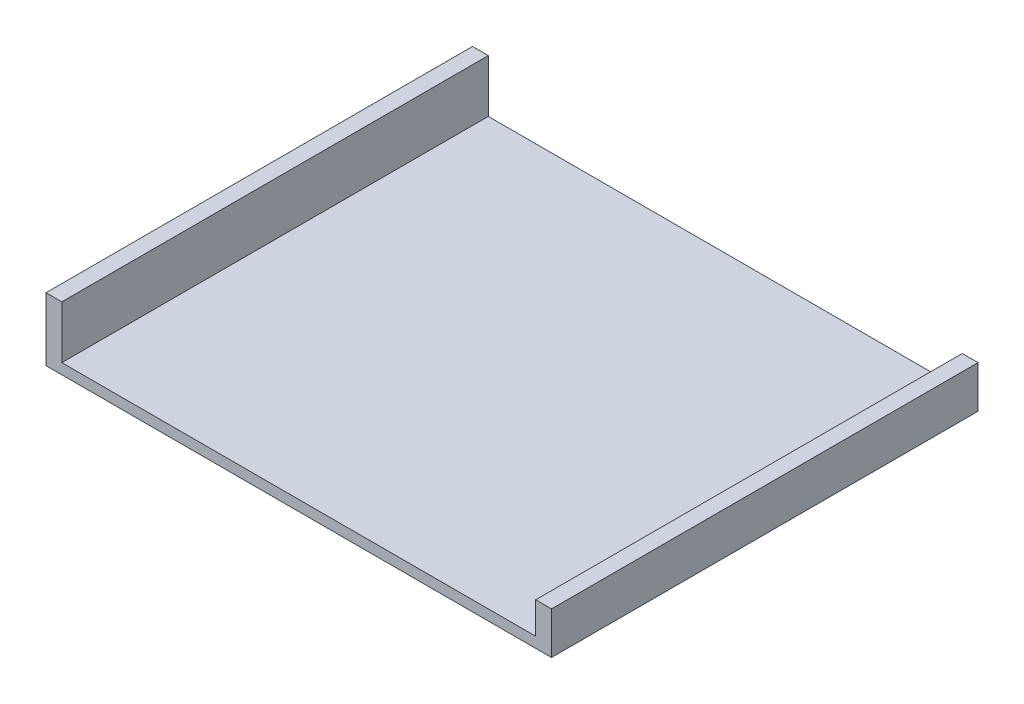
ISO-10303-21;
HEADER;
FILE_DESCRIPTION(('STEP AP214'),'2;1');
FILE_NAME('part.step','',(''),(''),'','','');
FILE_SCHEMA(('AUTOMOTIVE_DESIGN { 1 0 10303 214 1 1 1 1 }'));
ENDSEC;
DATA;
#1=APPLICATION_CONTEXT('core data for automotive mechanical design processes');
#2=APPLICATION_PROTOCOL_DEFINITION('international standard','automotive_design',2000,#1);
#3=PRODUCT_CONTEXT('',#1,'mechanical');
#4=PRODUCT('Part','Part','',(#3));
#5=PRODUCT_RELATED_PRODUCT_CATEGORY('part','',(#4));
#6=PRODUCT_DEFINITION_FORMATION('','',#4);
#7=PRODUCT_DEFINITION_CONTEXT('part definition',#1,'design');
#8=PRODUCT_DEFINITION('design','',#6,#7);
#9=PRODUCT_DEFINITION_SHAPE('','',#8);
#10=(LENGTH_UNIT() NAMED_UNIT(*) SI_UNIT(.MILLI.,.METRE.));
#11=(NAMED_UNIT(*) PLANE_ANGLE_UNIT() SI_UNIT($,.RADIAN.));
#12=(NAMED_UNIT(*) SI_UNIT($,.STERADIAN.) SOLID_ANGLE_UNIT());
#13=UNCERTAINTY_MEASURE_WITH_UNIT(LENGTH_MEASURE(1.E-05),#10,'distance_accuracy_value','');
#14=(GEOMETRIC_REPRESENTATION_CONTEXT(3) GLOBAL_UNCERTAINTY_ASSIGNED_CONTEXT((#13)) GLOBAL_UNIT_ASSIGNED_CONTEXT((#10,
#11,#12)) REPRESENTATION_CONTEXT('',''));
#15=CARTESIAN_POINT('',(0.,0.,0.));
#16=DIRECTION('',(0.,0.,1.));
#17=DIRECTION('',(1.,0.,0.));
#18=AXIS2_PLACEMENT_3D('',#15,#16,#17);
#19=CARTESIAN_POINT('',(-48.,2.,-40.5));
#20=DIRECTION('',(1.,0.,0.));
#21=DIRECTION('',(0.,0.,-1.));
#22=AXIS2_PLACEMENT_3D('',#19,#20,#21);
#23=PLANE('',#22);
#24=DIRECTION('',(0.,0.,1.));
#25=VECTOR('',#24,1.);
#26=CARTESIAN_POINT('',(-48.,0.,-40.5));
#27=LINE('',#26,#25);
#28=CARTESIAN_POINT('',(-48.,0.,-40.5));
#29=VERTEX_POINT('',#28);
#30=CARTESIAN_POINT('',(-48.,0.,40.5));
#31=VERTEX_POINT('',#30);
#32=EDGE_CURVE('E149',#29,#31,#27,.T.);
#33=ORIENTED_EDGE('',*,*,#32,.T.);
#34=DIRECTION('',(0.,-1.,0.));
#35=VECTOR('',#34,1.);
#36=CARTESIAN_POINT('',(-48.,2.,40.5));
#37=LINE('',#36,#35);
#38=CARTESIAN_POINT('',(-48.,12.,40.5));
#39=VERTEX_POINT('',#38);
#40=EDGE_CURVE('E11',#39,#31,#37,.T.);
#41=ORIENTED_EDGE('',*,*,#40,.F.);
#42=DIRECTION('',(0.,0.,1.));
#43=VECTOR('',#42,1.);
#44=CARTESIAN_POINT('',(-48.,12.,-40.5));
#45=LINE('',#44,#43);
#46=CARTESIAN_POINT('',(-48.,12.,-40.5));
#47=VERTEX_POINT('',#46);
#48=EDGE_CURVE('E129',#47,#39,#45,.T.);
#49=ORIENTED_EDGE('',*,*,#48,.F.);
#50=DIRECTION('',(0.,-1.,0.));
#51=VECTOR('',#50,1.);
#52=CARTESIAN_POINT('',(-48.,2.,-40.5));
#53=LINE('',#52,#51);
#54=EDGE_CURVE('E154',#47,#29,#53,.T.);
#55=ORIENTED_EDGE('',*,*,#54,.T.);
#56=EDGE_LOOP('',(#33,#41,#49,#55));
#57=FACE_BOUND('',#56,.T.);
#58=ADVANCED_FACE('F43',(#57),#23,.F.);
#59=CARTESIAN_POINT('',(-48.,2.,40.5));
#60=DIRECTION('',(0.,0.,-1.));
#61=DIRECTION('',(-1.,0.,0.));
#62=AXIS2_PLACEMENT_3D('',#59,#60,#61);
#63=PLANE('',#62);
#64=DIRECTION('',(1.,0.,0.));
#65=VECTOR('',#64,1.);
#66=CARTESIAN_POINT('',(-48.,0.,40.5));
#67=LINE('',#66,#65);
#68=CARTESIAN_POINT('',(48.,0.,40.5));
#69=VERTEX_POINT('',#68);
#70=EDGE_CURVE('E158',#31,#69,#67,.T.);
#71=ORIENTED_EDGE('',*,*,#70,.T.);
#72=DIRECTION('',(0.,-1.,0.));
#73=VECTOR('',#72,1.);
#74=CARTESIAN_POINT('',(48.,2.,40.5));
#75=LINE('',#74,#73);
#76=CARTESIAN_POINT('',(48.,8.,40.5));
#77=VERTEX_POINT('',#76);
#78=EDGE_CURVE('E49',#77,#69,#75,.T.);
#79=ORIENTED_EDGE('',*,*,#78,.F.);
#80=DIRECTION('',(1.,0.,0.));
#81=VECTOR('',#80,1.);
#82=CARTESIAN_POINT('',(45.,8.,40.5));
#83=LINE('',#82,#81);
#84=CARTESIAN_POINT('',(45.,8.,40.5));
#85=VERTEX_POINT('',#84);
#86=EDGE_CURVE('E106',#85,#77,#83,.T.);
#87=ORIENTED_EDGE('',*,*,#86,.F.);
#88=DIRECTION('',(0.,-1.,0.));
#89=VECTOR('',#88,1.);
#90=CARTESIAN_POINT('',(45.,8.,40.5));
#91=LINE('',#90,#89);
#92=CARTESIAN_POINT('',(45.,2.,40.5));
#93=VERTEX_POINT('',#92);
#94=EDGE_CURVE('E109',#85,#93,#91,.T.);
#95=ORIENTED_EDGE('',*,*,#94,.T.);
#96=DIRECTION('',(1.,0.,0.));
#97=VECTOR('',#96,1.);
#98=CARTESIAN_POINT('',(-48.,2.,40.5));
#99=LINE('',#98,#97);
#100=CARTESIAN_POINT('',(-45.,2.,40.5));
#101=VERTEX_POINT('',#100);
#102=EDGE_CURVE('E147',#101,#93,#99,.T.);
#103=ORIENTED_EDGE('',*,*,#102,.F.);
#104=DIRECTION('',(0.,-1.,0.));
#105=VECTOR('',#104,1.);
#106=CARTESIAN_POINT('',(-45.,12.,40.5));
#107=LINE('',#106,#105);
#108=CARTESIAN_POINT('',(-45.,12.,40.5));
#109=VERTEX_POINT('',#108);
#110=EDGE_CURVE('E148',#109,#101,#107,.T.);
#111=ORIENTED_EDGE('',*,*,#110,.F.);
#112=DIRECTION('',(1.,0.,0.));
#113=VECTOR('',#112,1.);
#114=CARTESIAN_POINT('',(-48.,12.,40.5));
#115=LINE('',#114,#113);
#116=EDGE_CURVE('E137',#39,#109,#115,.T.);
#117=ORIENTED_EDGE('',*,*,#116,.F.);
#118=ORIENTED_EDGE('',*,*,#40,.T.);
#119=EDGE_LOOP('',(#71,#79,#87,#95,#103,#111,#117,#118));
#120=FACE_BOUND('',#119,.T.);
#121=ADVANCED_FACE('F107',(#120),#63,.F.);
#122=CARTESIAN_POINT('',(48.,2.,40.5));
#123=DIRECTION('',(-1.,0.,0.));
#124=DIRECTION('',(0.,0.,1.));
#125=AXIS2_PLACEMENT_3D('',#122,#123,#124);
#126=PLANE('',#125);
#127=DIRECTION('',(0.,0.,-1.));
#128=VECTOR('',#127,1.);
#129=CARTESIAN_POINT('',(48.,0.,40.5));
#130=LINE('',#129,#128);
#131=CARTESIAN_POINT('',(48.,0.,-40.5));
#132=VERTEX_POINT('',#131);
#133=EDGE_CURVE('E159',#69,#132,#130,.T.);
#134=ORIENTED_EDGE('',*,*,#133,.T.);
#135=DIRECTION('',(0.,-1.,0.));
#136=VECTOR('',#135,1.);
#137=CARTESIAN_POINT('',(48.,2.,-40.5));
#138=LINE('',#137,#136);
#139=CARTESIAN_POINT('',(48.,8.,-40.5));
#140=VERTEX_POINT('',#139);
#141=EDGE_CURVE('E164',#140,#132,#138,.T.);
#142=ORIENTED_EDGE('',*,*,#141,.F.);
#143=DIRECTION('',(0.,0.,-1.));
#144=VECTOR('',#143,1.);
#145=CARTESIAN_POINT('',(48.,8.,40.5));
#146=LINE('',#145,#144);
#147=EDGE_CURVE('E113',#77,#140,#146,.T.);
#148=ORIENTED_EDGE('',*,*,#147,.F.);
#149=ORIENTED_EDGE('',*,*,#78,.T.);
#150=EDGE_LOOP('',(#134,#142,#148,#149));
#151=FACE_BOUND('',#150,.T.);
#152=ADVANCED_FACE('F166',(#151),#126,.F.);
#153=CARTESIAN_POINT('',(48.,2.,-40.5));
#154=DIRECTION('',(0.,0.,1.));
#155=DIRECTION('',(1.,0.,0.));
#156=AXIS2_PLACEMENT_3D('',#153,#154,#155);
#157=PLANE('',#156);
#158=DIRECTION('',(-1.,0.,0.));
#159=VECTOR('',#158,1.);
#160=CARTESIAN_POINT('',(48.,0.,-40.5));
#161=LINE('',#160,#159);
#162=EDGE_CURVE('E153',#132,#29,#161,.T.);
#163=ORIENTED_EDGE('',*,*,#162,.T.);
#164=ORIENTED_EDGE('',*,*,#54,.F.);
#165=DIRECTION('',(-1.,0.,0.));
#166=VECTOR('',#165,1.);
#167=CARTESIAN_POINT('',(-45.,12.,-40.5));
#168=LINE('',#167,#166);
#169=CARTESIAN_POINT('',(-45.,12.,-40.5));
#170=VERTEX_POINT('',#169);
#171=EDGE_CURVE('E136',#170,#47,#168,.T.);
#172=ORIENTED_EDGE('',*,*,#171,.F.);
#173=DIRECTION('',(0.,-1.,0.));
#174=VECTOR('',#173,1.);
#175=CARTESIAN_POINT('',(-45.,12.,-40.5));
#176=LINE('',#175,#174);
#177=CARTESIAN_POINT('',(-45.,2.,-40.5));
#178=VERTEX_POINT('',#177);
#179=EDGE_CURVE('E142',#170,#178,#176,.T.);
#180=ORIENTED_EDGE('',*,*,#179,.T.);
#181=DIRECTION('',(-1.,0.,0.));
#182=VECTOR('',#181,1.);
#183=CARTESIAN_POINT('',(48.,2.,-40.5));
#184=LINE('',#183,#182);
#185=CARTESIAN_POINT('',(45.,2.,-40.5));
#186=VERTEX_POINT('',#185);
#187=EDGE_CURVE('E155',#186,#178,#184,.T.);
#188=ORIENTED_EDGE('',*,*,#187,.F.);
#189=DIRECTION('',(0.,-1.,0.));
#190=VECTOR('',#189,1.);
#191=CARTESIAN_POINT('',(45.,8.,-40.5));
#192=LINE('',#191,#190);
#193=CARTESIAN_POINT('',(45.,8.,-40.5));
#194=VERTEX_POINT('',#193);
#195=EDGE_CURVE('E130',#194,#186,#192,.T.);
#196=ORIENTED_EDGE('',*,*,#195,.F.);
#197=DIRECTION('',(-1.,0.,0.));
#198=VECTOR('',#197,1.);
#199=CARTESIAN_POINT('',(48.,8.,-40.5));
#200=LINE('',#199,#198);
#201=EDGE_CURVE('E122',#140,#194,#200,.T.);
#202=ORIENTED_EDGE('',*,*,#201,.F.);
#203=ORIENTED_EDGE('',*,*,#141,.T.);
#204=EDGE_LOOP('',(#163,#164,#172,#180,#188,#196,#202,#203));
#205=FACE_BOUND('',#204,.T.);
#206=ADVANCED_FACE('F173',(#205),#157,.F.);
#207=CARTESIAN_POINT('',(0.,2.,0.));
#208=DIRECTION('',(0.,1.,0.));
#209=DIRECTION('',(0.,0.,1.));
#210=AXIS2_PLACEMENT_3D('',#207,#208,#209);
#211=PLANE('',#210);
#212=DIRECTION('',(0.,0.,1.));
#213=VECTOR('',#212,1.);
#214=CARTESIAN_POINT('',(45.,2.,-40.5));
#215=LINE('',#214,#213);
#216=EDGE_CURVE('E60',#186,#93,#215,.T.);
#217=ORIENTED_EDGE('',*,*,#216,.F.);
#218=ORIENTED_EDGE('',*,*,#187,.T.);
#219=DIRECTION('',(0.,0.,-1.));
#220=VECTOR('',#219,1.);
#221=CARTESIAN_POINT('',(-45.,2.,40.5));
#222=LINE('',#221,#220);
#223=EDGE_CURVE('E65',#101,#178,#222,.T.);
#224=ORIENTED_EDGE('',*,*,#223,.F.);
#225=ORIENTED_EDGE('',*,*,#102,.T.);
#226=EDGE_LOOP('',(#217,#218,#224,#225));
#227=FACE_BOUND('',#226,.T.);
#228=ADVANCED_FACE('F190',(#227),#211,.T.);
#229=CARTESIAN_POINT('',(0.,0.,0.));
#230=DIRECTION('',(0.,1.,0.));
#231=DIRECTION('',(0.,0.,1.));
#232=AXIS2_PLACEMENT_3D('',#229,#230,#231);
#233=PLANE('',#232);
#234=ORIENTED_EDGE('',*,*,#32,.F.);
#235=ORIENTED_EDGE('',*,*,#162,.F.);
#236=ORIENTED_EDGE('',*,*,#133,.F.);
#237=ORIENTED_EDGE('',*,*,#70,.F.);
#238=EDGE_LOOP('',(#234,#235,#236,#237));
#239=FACE_BOUND('',#238,.T.);
#240=ADVANCED_FACE('F174',(#239),#233,.F.);
#241=CARTESIAN_POINT('',(-45.,12.,40.5));
#242=DIRECTION('',(-1.,0.,0.));
#243=DIRECTION('',(0.,0.,1.));
#244=AXIS2_PLACEMENT_3D('',#241,#242,#243);
#245=PLANE('',#244);
#246=ORIENTED_EDGE('',*,*,#223,.T.);
#247=ORIENTED_EDGE('',*,*,#179,.F.);
#248=DIRECTION('',(0.,0.,-1.));
#249=VECTOR('',#248,1.);
#250=CARTESIAN_POINT('',(-45.,12.,40.5));
#251=LINE('',#250,#249);
#252=EDGE_CURVE('E138',#109,#170,#251,.T.);
#253=ORIENTED_EDGE('',*,*,#252,.F.);
#254=ORIENTED_EDGE('',*,*,#110,.T.);
#255=EDGE_LOOP('',(#246,#247,#253,#254));
#256=FACE_BOUND('',#255,.T.);
#257=ADVANCED_FACE('F187',(#256),#245,.F.);
#258=CARTESIAN_POINT('',(0.,12.,0.));
#259=DIRECTION('',(0.,1.,0.));
#260=DIRECTION('',(0.,0.,1.));
#261=AXIS2_PLACEMENT_3D('',#258,#259,#260);
#262=PLANE('',#261);
#263=ORIENTED_EDGE('',*,*,#48,.T.);
#264=ORIENTED_EDGE('',*,*,#116,.T.);
#265=ORIENTED_EDGE('',*,*,#252,.T.);
#266=ORIENTED_EDGE('',*,*,#171,.T.);
#267=EDGE_LOOP('',(#263,#264,#265,#266));
#268=FACE_BOUND('',#267,.T.);
#269=ADVANCED_FACE('F182',(#268),#262,.T.);
#270=CARTESIAN_POINT('',(45.,8.,-40.5));
#271=DIRECTION('',(1.,0.,0.));
#272=DIRECTION('',(0.,0.,-1.));
#273=AXIS2_PLACEMENT_3D('',#270,#271,#272);
#274=PLANE('',#273);
#275=ORIENTED_EDGE('',*,*,#216,.T.);
#276=ORIENTED_EDGE('',*,*,#94,.F.);
#277=DIRECTION('',(0.,0.,1.));
#278=VECTOR('',#277,1.);
#279=CARTESIAN_POINT('',(45.,8.,-40.5));
#280=LINE('',#279,#278);
#281=EDGE_CURVE('E117',#194,#85,#280,.T.);
#282=ORIENTED_EDGE('',*,*,#281,.F.);
#283=ORIENTED_EDGE('',*,*,#195,.T.);
#284=EDGE_LOOP('',(#275,#276,#282,#283));
#285=FACE_BOUND('',#284,.T.);
#286=ADVANCED_FACE('F127',(#285),#274,.F.);
#287=CARTESIAN_POINT('',(0.,8.,0.));
#288=DIRECTION('',(0.,1.,0.));
#289=DIRECTION('',(0.,0.,1.));
#290=AXIS2_PLACEMENT_3D('',#287,#288,#289);
#291=PLANE('',#290);
#292=ORIENTED_EDGE('',*,*,#281,.T.);
#293=ORIENTED_EDGE('',*,*,#86,.T.);
#294=ORIENTED_EDGE('',*,*,#147,.T.);
#295=ORIENTED_EDGE('',*,*,#201,.T.);
#296=EDGE_LOOP('',(#292,#293,#294,#295));
#297=FACE_BOUND('',#296,.T.);
#298=ADVANCED_FACE('F116',(#297),#291,.T.);
#299=CLOSED_SHELL('',(#58,#121,#152,#206,#228,#240,#257,#269,#286,#298));
#300=MANIFOLD_SOLID_BREP('B2',#299);
#301=ADVANCED_BREP_SHAPE_REPRESENTATION('',(#18,#300),#14);
#302=SHAPE_DEFINITION_REPRESENTATION(#9,#301);
ENDSEC;
END-ISO-10303-21;
